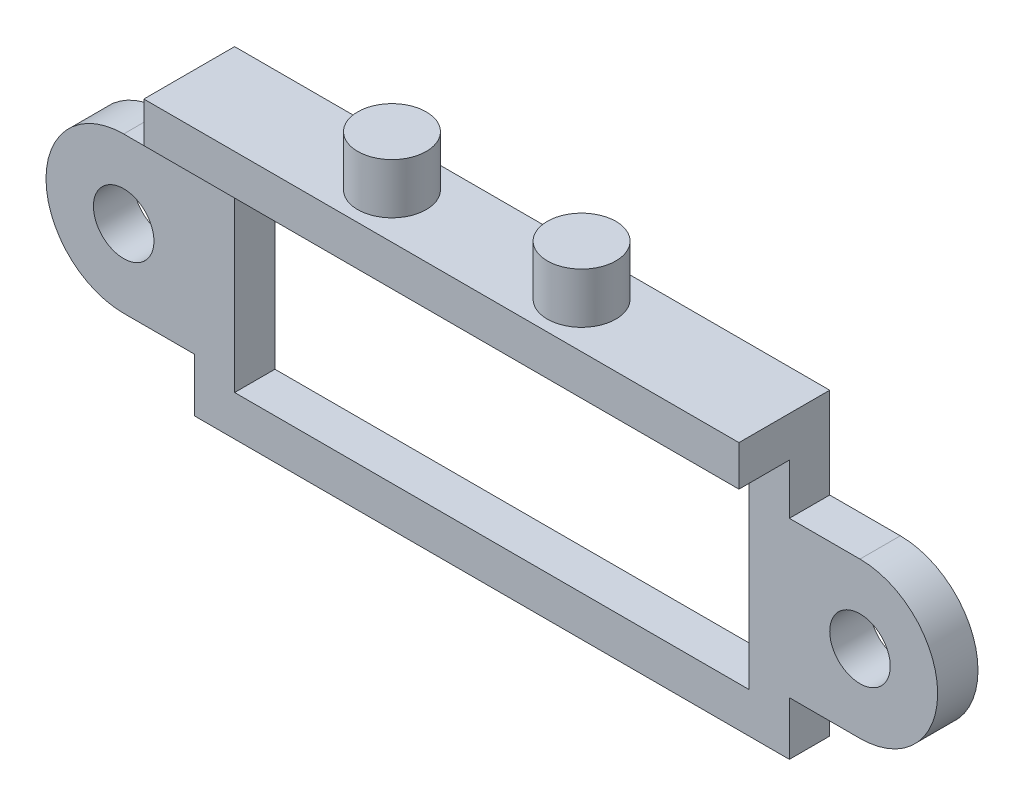
ISO-10303-21;
HEADER;
FILE_DESCRIPTION(('STEP AP214'),'2;1');
FILE_NAME('part.step','',(''),(''),'','','');
FILE_SCHEMA(('AUTOMOTIVE_DESIGN { 1 0 10303 214 1 1 1 1 }'));
ENDSEC;
DATA;
#1=APPLICATION_CONTEXT('core data for automotive mechanical design processes');
#2=APPLICATION_PROTOCOL_DEFINITION('international standard','automotive_design',2000,#1);
#3=PRODUCT_CONTEXT('',#1,'mechanical');
#4=PRODUCT('Part','Part','',(#3));
#5=PRODUCT_RELATED_PRODUCT_CATEGORY('part','',(#4));
#6=PRODUCT_DEFINITION_FORMATION('','',#4);
#7=PRODUCT_DEFINITION_CONTEXT('part definition',#1,'design');
#8=PRODUCT_DEFINITION('design','',#6,#7);
#9=PRODUCT_DEFINITION_SHAPE('','',#8);
#10=(LENGTH_UNIT() NAMED_UNIT(*) SI_UNIT(.MILLI.,.METRE.));
#11=(NAMED_UNIT(*) PLANE_ANGLE_UNIT() SI_UNIT($,.RADIAN.));
#12=(NAMED_UNIT(*) SI_UNIT($,.STERADIAN.) SOLID_ANGLE_UNIT());
#13=UNCERTAINTY_MEASURE_WITH_UNIT(LENGTH_MEASURE(1.E-05),#10,'distance_accuracy_value','');
#14=(GEOMETRIC_REPRESENTATION_CONTEXT(3) GLOBAL_UNCERTAINTY_ASSIGNED_CONTEXT((#13)) GLOBAL_UNIT_ASSIGNED_CONTEXT((#10,
#11,#12)) REPRESENTATION_CONTEXT('',''));
#15=CARTESIAN_POINT('',(0.,0.,0.));
#16=DIRECTION('',(0.,0.,1.));
#17=DIRECTION('',(1.,0.,0.));
#18=AXIS2_PLACEMENT_3D('',#15,#16,#17);
#19=CARTESIAN_POINT('',(-14.75,5.675,2.));
#20=DIRECTION('',(0.,-1.,0.));
#21=DIRECTION('',(1.,0.,0.));
#22=AXIS2_PLACEMENT_3D('',#19,#20,#21);
#23=PLANE('',#22);
#24=CARTESIAN_POINT('',(-4.7,5.675,2.25));
#25=DIRECTION('',(0.,-1.,0.));
#26=DIRECTION('',(1.,0.,0.));
#27=AXIS2_PLACEMENT_3D('',#24,#25,#26);
#28=CIRCLE('',#27,1.7);
#29=CARTESIAN_POINT('',(-3.,5.675,2.25));
#30=VERTEX_POINT('',#29);
#31=EDGE_CURVE('E43',#30,#30,#28,.F.);
#32=ORIENTED_EDGE('',*,*,#31,.F.);
#33=EDGE_LOOP('',(#32));
#34=FACE_BOUND('',#33,.T.);
#35=DIRECTION('',(-1.,0.,0.));
#36=VECTOR('',#35,1.);
#37=CARTESIAN_POINT('',(-14.75,5.675,0.));
#38=LINE('',#37,#36);
#39=CARTESIAN_POINT('',(14.75,5.675,0.));
#40=VERTEX_POINT('',#39);
#41=CARTESIAN_POINT('',(-14.75,5.675,0.));
#42=VERTEX_POINT('',#41);
#43=EDGE_CURVE('E306',#40,#42,#38,.T.);
#44=ORIENTED_EDGE('',*,*,#43,.T.);
#45=DIRECTION('',(0.,0.,-1.));
#46=VECTOR('',#45,1.);
#47=CARTESIAN_POINT('',(-14.75,5.675,2.));
#48=LINE('',#47,#46);
#49=CARTESIAN_POINT('',(-14.75,5.675,4.5));
#50=VERTEX_POINT('',#49);
#51=EDGE_CURVE('E284',#50,#42,#48,.T.);
#52=ORIENTED_EDGE('',*,*,#51,.F.);
#53=DIRECTION('',(-1.,0.,0.));
#54=VECTOR('',#53,1.);
#55=CARTESIAN_POINT('',(-14.75,5.675,4.5));
#56=LINE('',#55,#54);
#57=CARTESIAN_POINT('',(14.75,5.675,4.5));
#58=VERTEX_POINT('',#57);
#59=EDGE_CURVE('E179',#58,#50,#56,.T.);
#60=ORIENTED_EDGE('',*,*,#59,.F.);
#61=DIRECTION('',(0.,0.,-1.));
#62=VECTOR('',#61,1.);
#63=CARTESIAN_POINT('',(14.75,5.675,2.));
#64=LINE('',#63,#62);
#65=EDGE_CURVE('E281',#58,#40,#64,.T.);
#66=ORIENTED_EDGE('',*,*,#65,.T.);
#67=EDGE_LOOP('',(#44,#52,#60,#66));
#68=FACE_BOUND('',#67,.T.);
#69=CARTESIAN_POINT('',(4.7,5.675,2.25));
#70=DIRECTION('',(0.,-1.,0.));
#71=DIRECTION('',(1.,0.,0.));
#72=AXIS2_PLACEMENT_3D('',#69,#70,#71);
#73=CIRCLE('',#72,1.7);
#74=CARTESIAN_POINT('',(6.4,5.675,2.25));
#75=VERTEX_POINT('',#74);
#76=EDGE_CURVE('E11',#75,#75,#73,.F.);
#77=ORIENTED_EDGE('',*,*,#76,.F.);
#78=EDGE_LOOP('',(#77));
#79=FACE_BOUND('',#78,.T.);
#80=ADVANCED_FACE('F35',(#34,#68,#79),#23,.F.);
#81=CARTESIAN_POINT('',(18.25,-2.67499999999998,2.));
#82=DIRECTION('',(0.,0.,-1.));
#83=DIRECTION('',(-1.,0.,0.));
#84=AXIS2_PLACEMENT_3D('',#81,#82,#83);
#85=PLANE('',#84);
#86=CARTESIAN_POINT('',(-18.25,-2.675,2.));
#87=DIRECTION('',(0.,0.,1.));
#88=DIRECTION('',(1.,0.,0.));
#89=AXIS2_PLACEMENT_3D('',#86,#87,#88);
#90=CIRCLE('',#89,1.5);
#91=CARTESIAN_POINT('',(-16.75,-2.675,2.));
#92=VERTEX_POINT('',#91);
#93=EDGE_CURVE('E242',#92,#92,#90,.T.);
#94=ORIENTED_EDGE('',*,*,#93,.F.);
#95=EDGE_LOOP('',(#94));
#96=FACE_BOUND('',#95,.T.);
#97=CARTESIAN_POINT('',(18.25,-2.67499999999998,2.));
#98=DIRECTION('',(0.,0.,1.));
#99=DIRECTION('',(-1.,0.,0.));
#100=AXIS2_PLACEMENT_3D('',#97,#98,#99);
#101=CIRCLE('',#100,1.5);
#102=CARTESIAN_POINT('',(16.75,-2.67499999999998,2.));
#103=VERTEX_POINT('',#102);
#104=EDGE_CURVE('E236',#103,#103,#101,.T.);
#105=ORIENTED_EDGE('',*,*,#104,.F.);
#106=EDGE_LOOP('',(#105));
#107=FACE_BOUND('',#106,.T.);
#108=DIRECTION('',(1.,0.,0.));
#109=VECTOR('',#108,1.);
#110=CARTESIAN_POINT('',(-14.75,3.675,2.));
#111=LINE('',#110,#109);
#112=CARTESIAN_POINT('',(-14.75,3.675,2.));
#113=VERTEX_POINT('',#112);
#114=CARTESIAN_POINT('',(-12.75,3.675,2.));
#115=VERTEX_POINT('',#114);
#116=EDGE_CURVE('E50',#113,#115,#111,.T.);
#117=ORIENTED_EDGE('',*,*,#116,.F.);
#118=DIRECTION('',(0.,-1.,0.));
#119=VECTOR('',#118,1.);
#120=CARTESIAN_POINT('',(-14.75,5.675,2.));
#121=LINE('',#120,#119);
#122=CARTESIAN_POINT('',(-14.75,1.175,2.));
#123=VERTEX_POINT('',#122);
#124=EDGE_CURVE('E185',#113,#123,#121,.T.);
#125=ORIENTED_EDGE('',*,*,#124,.T.);
#126=DIRECTION('',(-1.,0.,0.));
#127=VECTOR('',#126,1.);
#128=CARTESIAN_POINT('',(-14.75,1.175,2.));
#129=LINE('',#128,#127);
#130=CARTESIAN_POINT('',(-18.25,1.175,2.));
#131=VERTEX_POINT('',#130);
#132=EDGE_CURVE('E324',#123,#131,#129,.T.);
#133=ORIENTED_EDGE('',*,*,#132,.T.);
#134=CARTESIAN_POINT('',(-18.25,-2.675,2.));
#135=DIRECTION('',(0.,0.,1.));
#136=DIRECTION('',(1.,0.,0.));
#137=AXIS2_PLACEMENT_3D('',#134,#135,#136);
#138=CIRCLE('',#137,3.85);
#139=CARTESIAN_POINT('',(-18.25,-6.525,2.));
#140=VERTEX_POINT('',#139);
#141=EDGE_CURVE('E323',#131,#140,#138,.T.);
#142=ORIENTED_EDGE('',*,*,#141,.T.);
#143=DIRECTION('',(1.,0.,0.));
#144=VECTOR('',#143,1.);
#145=CARTESIAN_POINT('',(-14.75,-6.525,2.));
#146=LINE('',#145,#144);
#147=CARTESIAN_POINT('',(-14.75,-6.525,2.));
#148=VERTEX_POINT('',#147);
#149=EDGE_CURVE('E298',#140,#148,#146,.T.);
#150=ORIENTED_EDGE('',*,*,#149,.T.);
#151=DIRECTION('',(0.,-1.,0.));
#152=VECTOR('',#151,1.);
#153=CARTESIAN_POINT('',(-14.75,-6.525,2.));
#154=LINE('',#153,#152);
#155=CARTESIAN_POINT('',(-14.75,-9.175,2.));
#156=VERTEX_POINT('',#155);
#157=EDGE_CURVE('E248',#148,#156,#154,.T.);
#158=ORIENTED_EDGE('',*,*,#157,.T.);
#159=DIRECTION('',(1.,0.,0.));
#160=VECTOR('',#159,1.);
#161=CARTESIAN_POINT('',(-14.75,-9.175,2.));
#162=LINE('',#161,#160);
#163=CARTESIAN_POINT('',(14.75,-9.17499999999998,2.));
#164=VERTEX_POINT('',#163);
#165=EDGE_CURVE('E251',#156,#164,#162,.T.);
#166=ORIENTED_EDGE('',*,*,#165,.T.);
#167=DIRECTION('',(0.,1.,0.));
#168=VECTOR('',#167,1.);
#169=CARTESIAN_POINT('',(14.75,-6.52499999999998,2.));
#170=LINE('',#169,#168);
#171=CARTESIAN_POINT('',(14.75,-6.52499999999998,2.));
#172=VERTEX_POINT('',#171);
#173=EDGE_CURVE('E254',#164,#172,#170,.T.);
#174=ORIENTED_EDGE('',*,*,#173,.T.);
#175=DIRECTION('',(1.,0.,0.));
#176=VECTOR('',#175,1.);
#177=CARTESIAN_POINT('',(14.75,-6.52499999999998,2.));
#178=LINE('',#177,#176);
#179=CARTESIAN_POINT('',(18.25,-6.52499999999997,2.));
#180=VERTEX_POINT('',#179);
#181=EDGE_CURVE('E256',#172,#180,#178,.T.);
#182=ORIENTED_EDGE('',*,*,#181,.T.);
#183=CARTESIAN_POINT('',(18.25,-2.67499999999998,2.));
#184=DIRECTION('',(0.,0.,1.));
#185=DIRECTION('',(-1.,0.,0.));
#186=AXIS2_PLACEMENT_3D('',#183,#184,#185);
#187=CIRCLE('',#186,3.85);
#188=CARTESIAN_POINT('',(18.25,1.17500000000002,2.));
#189=VERTEX_POINT('',#188);
#190=EDGE_CURVE('E258',#180,#189,#187,.T.);
#191=ORIENTED_EDGE('',*,*,#190,.T.);
#192=DIRECTION('',(-1.,0.,0.));
#193=VECTOR('',#192,1.);
#194=CARTESIAN_POINT('',(14.75,1.17500000000002,2.));
#195=LINE('',#194,#193);
#196=CARTESIAN_POINT('',(14.75,1.17500000000002,2.));
#197=VERTEX_POINT('',#196);
#198=EDGE_CURVE('E260',#189,#197,#195,.T.);
#199=ORIENTED_EDGE('',*,*,#198,.T.);
#200=DIRECTION('',(0.,1.,0.));
#201=VECTOR('',#200,1.);
#202=CARTESIAN_POINT('',(14.75,5.675,2.));
#203=LINE('',#202,#201);
#204=CARTESIAN_POINT('',(14.75,3.675,2.));
#205=VERTEX_POINT('',#204);
#206=EDGE_CURVE('E262',#197,#205,#203,.T.);
#207=ORIENTED_EDGE('',*,*,#206,.T.);
#208=CARTESIAN_POINT('',(12.75,3.675,2.));
#209=VERTEX_POINT('',#208);
#210=EDGE_CURVE('E57',#209,#205,#111,.T.);
#211=ORIENTED_EDGE('',*,*,#210,.F.);
#212=DIRECTION('',(0.,1.,0.));
#213=VECTOR('',#212,1.);
#214=CARTESIAN_POINT('',(12.75,-7.175,2.));
#215=LINE('',#214,#213);
#216=CARTESIAN_POINT('',(12.75,-7.175,2.));
#217=VERTEX_POINT('',#216);
#218=EDGE_CURVE('E218',#217,#209,#215,.T.);
#219=ORIENTED_EDGE('',*,*,#218,.F.);
#220=DIRECTION('',(1.,0.,0.));
#221=VECTOR('',#220,1.);
#222=CARTESIAN_POINT('',(-12.75,-7.175,2.));
#223=LINE('',#222,#221);
#224=CARTESIAN_POINT('',(-12.75,-7.175,2.));
#225=VERTEX_POINT('',#224);
#226=EDGE_CURVE('E217',#225,#217,#223,.T.);
#227=ORIENTED_EDGE('',*,*,#226,.F.);
#228=DIRECTION('',(0.,-1.,0.));
#229=VECTOR('',#228,1.);
#230=CARTESIAN_POINT('',(-12.75,-7.175,2.));
#231=LINE('',#230,#229);
#232=EDGE_CURVE('E219',#115,#225,#231,.T.);
#233=ORIENTED_EDGE('',*,*,#232,.F.);
#234=EDGE_LOOP('',(#117,#125,#133,#142,#150,#158,#166,#174,#182,#191,#199,#207,#211,#219,#227,#233));
#235=FACE_BOUND('',#234,.T.);
#236=ADVANCED_FACE('F327',(#96,#107,#235),#85,.F.);
#237=CARTESIAN_POINT('',(18.25,-2.67499999999998,0.));
#238=DIRECTION('',(0.,0.,-1.));
#239=DIRECTION('',(-1.,0.,0.));
#240=AXIS2_PLACEMENT_3D('',#237,#238,#239);
#241=PLANE('',#240);
#242=CARTESIAN_POINT('',(18.25,-2.67499999999998,0.));
#243=DIRECTION('',(0.,0.,1.));
#244=DIRECTION('',(-1.,0.,0.));
#245=AXIS2_PLACEMENT_3D('',#242,#243,#244);
#246=CIRCLE('',#245,1.5);
#247=CARTESIAN_POINT('',(16.75,-2.67499999999998,0.));
#248=VERTEX_POINT('',#247);
#249=EDGE_CURVE('E235',#248,#248,#246,.T.);
#250=ORIENTED_EDGE('',*,*,#249,.T.);
#251=EDGE_LOOP('',(#250));
#252=FACE_BOUND('',#251,.T.);
#253=DIRECTION('',(0.,-1.,0.));
#254=VECTOR('',#253,1.);
#255=CARTESIAN_POINT('',(-14.75,-6.525,0.));
#256=LINE('',#255,#254);
#257=CARTESIAN_POINT('',(-14.75,-6.525,0.));
#258=VERTEX_POINT('',#257);
#259=CARTESIAN_POINT('',(-14.75,-9.175,0.));
#260=VERTEX_POINT('',#259);
#261=EDGE_CURVE('E245',#258,#260,#256,.T.);
#262=ORIENTED_EDGE('',*,*,#261,.F.);
#263=DIRECTION('',(1.,0.,0.));
#264=VECTOR('',#263,1.);
#265=CARTESIAN_POINT('',(-14.75,-6.525,0.));
#266=LINE('',#265,#264);
#267=CARTESIAN_POINT('',(-18.25,-6.525,0.));
#268=VERTEX_POINT('',#267);
#269=EDGE_CURVE('E252',#268,#258,#266,.T.);
#270=ORIENTED_EDGE('',*,*,#269,.F.);
#271=CARTESIAN_POINT('',(-18.25,-2.675,0.));
#272=DIRECTION('',(0.,0.,1.));
#273=DIRECTION('',(1.,0.,0.));
#274=AXIS2_PLACEMENT_3D('',#271,#272,#273);
#275=CIRCLE('',#274,3.85);
#276=CARTESIAN_POINT('',(-18.25,1.175,0.));
#277=VERTEX_POINT('',#276);
#278=EDGE_CURVE('E300',#277,#268,#275,.T.);
#279=ORIENTED_EDGE('',*,*,#278,.F.);
#280=DIRECTION('',(-1.,0.,0.));
#281=VECTOR('',#280,1.);
#282=CARTESIAN_POINT('',(-14.75,1.175,0.));
#283=LINE('',#282,#281);
#284=CARTESIAN_POINT('',(-14.75,1.175,0.));
#285=VERTEX_POINT('',#284);
#286=EDGE_CURVE('E302',#285,#277,#283,.T.);
#287=ORIENTED_EDGE('',*,*,#286,.F.);
#288=DIRECTION('',(0.,-1.,0.));
#289=VECTOR('',#288,1.);
#290=CARTESIAN_POINT('',(-14.75,5.675,0.));
#291=LINE('',#290,#289);
#292=EDGE_CURVE('E304',#42,#285,#291,.T.);
#293=ORIENTED_EDGE('',*,*,#292,.F.);
#294=ORIENTED_EDGE('',*,*,#43,.F.);
#295=DIRECTION('',(0.,1.,0.));
#296=VECTOR('',#295,1.);
#297=CARTESIAN_POINT('',(14.75,5.675,0.));
#298=LINE('',#297,#296);
#299=CARTESIAN_POINT('',(14.75,1.17500000000002,0.));
#300=VERTEX_POINT('',#299);
#301=EDGE_CURVE('E308',#300,#40,#298,.T.);
#302=ORIENTED_EDGE('',*,*,#301,.F.);
#303=DIRECTION('',(-1.,0.,0.));
#304=VECTOR('',#303,1.);
#305=CARTESIAN_POINT('',(14.75,1.17500000000002,0.));
#306=LINE('',#305,#304);
#307=CARTESIAN_POINT('',(18.25,1.17500000000002,0.));
#308=VERTEX_POINT('',#307);
#309=EDGE_CURVE('E310',#308,#300,#306,.T.);
#310=ORIENTED_EDGE('',*,*,#309,.F.);
#311=CARTESIAN_POINT('',(18.25,-2.67499999999998,0.));
#312=DIRECTION('',(0.,0.,1.));
#313=DIRECTION('',(-1.,0.,0.));
#314=AXIS2_PLACEMENT_3D('',#311,#312,#313);
#315=CIRCLE('',#314,3.85);
#316=CARTESIAN_POINT('',(18.25,-6.52499999999997,0.));
#317=VERTEX_POINT('',#316);
#318=EDGE_CURVE('E312',#317,#308,#315,.T.);
#319=ORIENTED_EDGE('',*,*,#318,.F.);
#320=DIRECTION('',(1.,0.,0.));
#321=VECTOR('',#320,1.);
#322=CARTESIAN_POINT('',(14.75,-6.52499999999998,0.));
#323=LINE('',#322,#321);
#324=CARTESIAN_POINT('',(14.75,-6.52499999999998,0.));
#325=VERTEX_POINT('',#324);
#326=EDGE_CURVE('E314',#325,#317,#323,.T.);
#327=ORIENTED_EDGE('',*,*,#326,.F.);
#328=DIRECTION('',(0.,1.,0.));
#329=VECTOR('',#328,1.);
#330=CARTESIAN_POINT('',(14.75,-6.52499999999998,0.));
#331=LINE('',#330,#329);
#332=CARTESIAN_POINT('',(14.75,-9.17499999999998,0.));
#333=VERTEX_POINT('',#332);
#334=EDGE_CURVE('E316',#333,#325,#331,.T.);
#335=ORIENTED_EDGE('',*,*,#334,.F.);
#336=DIRECTION('',(1.,0.,0.));
#337=VECTOR('',#336,1.);
#338=CARTESIAN_POINT('',(-14.75,-9.175,0.));
#339=LINE('',#338,#337);
#340=EDGE_CURVE('E318',#260,#333,#339,.T.);
#341=ORIENTED_EDGE('',*,*,#340,.F.);
#342=EDGE_LOOP('',(#262,#270,#279,#287,#293,#294,#302,#310,#319,#327,#335,#341));
#343=FACE_BOUND('',#342,.T.);
#344=CARTESIAN_POINT('',(-18.25,-2.675,0.));
#345=DIRECTION('',(0.,0.,1.));
#346=DIRECTION('',(1.,0.,0.));
#347=AXIS2_PLACEMENT_3D('',#344,#345,#346);
#348=CIRCLE('',#347,1.5);
#349=CARTESIAN_POINT('',(-16.75,-2.675,0.));
#350=VERTEX_POINT('',#349);
#351=EDGE_CURVE('E239',#350,#350,#348,.T.);
#352=ORIENTED_EDGE('',*,*,#351,.T.);
#353=EDGE_LOOP('',(#352));
#354=FACE_BOUND('',#353,.T.);
#355=DIRECTION('',(-1.,0.,0.));
#356=VECTOR('',#355,1.);
#357=CARTESIAN_POINT('',(-12.75,3.675,0.));
#358=LINE('',#357,#356);
#359=CARTESIAN_POINT('',(12.75,3.675,0.));
#360=VERTEX_POINT('',#359);
#361=CARTESIAN_POINT('',(-12.75,3.675,0.));
#362=VERTEX_POINT('',#361);
#363=EDGE_CURVE('E226',#360,#362,#358,.T.);
#364=ORIENTED_EDGE('',*,*,#363,.T.);
#365=DIRECTION('',(0.,-1.,0.));
#366=VECTOR('',#365,1.);
#367=CARTESIAN_POINT('',(-12.75,-7.175,0.));
#368=LINE('',#367,#366);
#369=CARTESIAN_POINT('',(-12.75,-7.175,0.));
#370=VERTEX_POINT('',#369);
#371=EDGE_CURVE('E186',#362,#370,#368,.T.);
#372=ORIENTED_EDGE('',*,*,#371,.T.);
#373=DIRECTION('',(1.,0.,0.));
#374=VECTOR('',#373,1.);
#375=CARTESIAN_POINT('',(-12.75,-7.175,0.));
#376=LINE('',#375,#374);
#377=CARTESIAN_POINT('',(12.75,-7.175,0.));
#378=VERTEX_POINT('',#377);
#379=EDGE_CURVE('E189',#370,#378,#376,.T.);
#380=ORIENTED_EDGE('',*,*,#379,.T.);
#381=DIRECTION('',(0.,1.,0.));
#382=VECTOR('',#381,1.);
#383=CARTESIAN_POINT('',(12.75,-7.175,0.));
#384=LINE('',#383,#382);
#385=EDGE_CURVE('E223',#378,#360,#384,.T.);
#386=ORIENTED_EDGE('',*,*,#385,.T.);
#387=EDGE_LOOP('',(#364,#372,#380,#386));
#388=FACE_BOUND('',#387,.T.);
#389=ADVANCED_FACE('F395',(#252,#343,#354,#388),#241,.T.);
#390=CARTESIAN_POINT('',(-14.75,-6.525,2.));
#391=DIRECTION('',(1.,0.,0.));
#392=DIRECTION('',(0.,0.,-1.));
#393=AXIS2_PLACEMENT_3D('',#390,#391,#392);
#394=PLANE('',#393);
#395=ORIENTED_EDGE('',*,*,#261,.T.);
#396=DIRECTION('',(0.,0.,-1.));
#397=VECTOR('',#396,1.);
#398=CARTESIAN_POINT('',(-14.75,-9.175,2.));
#399=LINE('',#398,#397);
#400=EDGE_CURVE('E200',#156,#260,#399,.T.);
#401=ORIENTED_EDGE('',*,*,#400,.F.);
#402=ORIENTED_EDGE('',*,*,#157,.F.);
#403=DIRECTION('',(0.,0.,-1.));
#404=VECTOR('',#403,1.);
#405=CARTESIAN_POINT('',(-14.75,-6.525,2.));
#406=LINE('',#405,#404);
#407=EDGE_CURVE('E295',#148,#258,#406,.T.);
#408=ORIENTED_EDGE('',*,*,#407,.T.);
#409=EDGE_LOOP('',(#395,#401,#402,#408));
#410=FACE_BOUND('',#409,.T.);
#411=ADVANCED_FACE('F37',(#410),#394,.F.);
#412=CARTESIAN_POINT('',(-14.75,-9.175,2.));
#413=DIRECTION('',(0.,1.,0.));
#414=DIRECTION('',(-1.,0.,0.));
#415=AXIS2_PLACEMENT_3D('',#412,#413,#414);
#416=PLANE('',#415);
#417=ORIENTED_EDGE('',*,*,#340,.T.);
#418=DIRECTION('',(0.,0.,-1.));
#419=VECTOR('',#418,1.);
#420=CARTESIAN_POINT('',(14.75,-9.17499999999998,2.));
#421=LINE('',#420,#419);
#422=EDGE_CURVE('E203',#164,#333,#421,.T.);
#423=ORIENTED_EDGE('',*,*,#422,.F.);
#424=ORIENTED_EDGE('',*,*,#165,.F.);
#425=ORIENTED_EDGE('',*,*,#400,.T.);
#426=EDGE_LOOP('',(#417,#423,#424,#425));
#427=FACE_BOUND('',#426,.T.);
#428=ADVANCED_FACE('F347',(#427),#416,.F.);
#429=CARTESIAN_POINT('',(14.75,-6.52499999999998,2.));
#430=DIRECTION('',(-1.,0.,0.));
#431=DIRECTION('',(0.,-1.,0.));
#432=AXIS2_PLACEMENT_3D('',#429,#430,#431);
#433=PLANE('',#432);
#434=ORIENTED_EDGE('',*,*,#334,.T.);
#435=DIRECTION('',(0.,0.,-1.));
#436=VECTOR('',#435,1.);
#437=CARTESIAN_POINT('',(14.75,-6.52499999999998,2.));
#438=LINE('',#437,#436);
#439=EDGE_CURVE('E269',#172,#325,#438,.T.);
#440=ORIENTED_EDGE('',*,*,#439,.F.);
#441=ORIENTED_EDGE('',*,*,#173,.F.);
#442=ORIENTED_EDGE('',*,*,#422,.T.);
#443=EDGE_LOOP('',(#434,#440,#441,#442));
#444=FACE_BOUND('',#443,.T.);
#445=ADVANCED_FACE('F354',(#444),#433,.F.);
#446=CARTESIAN_POINT('',(14.75,-6.52499999999998,2.));
#447=DIRECTION('',(0.,1.,0.));
#448=DIRECTION('',(-1.,0.,0.));
#449=AXIS2_PLACEMENT_3D('',#446,#447,#448);
#450=PLANE('',#449);
#451=ORIENTED_EDGE('',*,*,#326,.T.);
#452=DIRECTION('',(0.,0.,-1.));
#453=VECTOR('',#452,1.);
#454=CARTESIAN_POINT('',(18.25,-6.52499999999997,2.));
#455=LINE('',#454,#453);
#456=EDGE_CURVE('E272',#180,#317,#455,.T.);
#457=ORIENTED_EDGE('',*,*,#456,.F.);
#458=ORIENTED_EDGE('',*,*,#181,.F.);
#459=ORIENTED_EDGE('',*,*,#439,.T.);
#460=EDGE_LOOP('',(#451,#457,#458,#459));
#461=FACE_BOUND('',#460,.T.);
#462=ADVANCED_FACE('F358',(#461),#450,.F.);
#463=CARTESIAN_POINT('',(18.25,-2.67499999999998,2.));
#464=DIRECTION('',(0.,0.,-1.));
#465=DIRECTION('',(-1.,0.,0.));
#466=AXIS2_PLACEMENT_3D('',#463,#464,#465);
#467=CYLINDRICAL_SURFACE('',#466,3.85);
#468=ORIENTED_EDGE('',*,*,#318,.T.);
#469=DIRECTION('',(0.,0.,-1.));
#470=VECTOR('',#469,1.);
#471=CARTESIAN_POINT('',(18.25,1.17500000000002,2.));
#472=LINE('',#471,#470);
#473=EDGE_CURVE('E275',#189,#308,#472,.T.);
#474=ORIENTED_EDGE('',*,*,#473,.F.);
#475=ORIENTED_EDGE('',*,*,#190,.F.);
#476=ORIENTED_EDGE('',*,*,#456,.T.);
#477=EDGE_LOOP('',(#468,#474,#475,#476));
#478=FACE_BOUND('',#477,.T.);
#479=ADVANCED_FACE('F363',(#478),#467,.T.);
#480=CARTESIAN_POINT('',(14.75,1.17500000000002,2.));
#481=DIRECTION('',(0.,-1.,0.));
#482=DIRECTION('',(1.,0.,0.));
#483=AXIS2_PLACEMENT_3D('',#480,#481,#482);
#484=PLANE('',#483);
#485=ORIENTED_EDGE('',*,*,#309,.T.);
#486=DIRECTION('',(0.,0.,-1.));
#487=VECTOR('',#486,1.);
#488=CARTESIAN_POINT('',(14.75,1.17500000000002,2.));
#489=LINE('',#488,#487);
#490=EDGE_CURVE('E278',#197,#300,#489,.T.);
#491=ORIENTED_EDGE('',*,*,#490,.F.);
#492=ORIENTED_EDGE('',*,*,#198,.F.);
#493=ORIENTED_EDGE('',*,*,#473,.T.);
#494=EDGE_LOOP('',(#485,#491,#492,#493));
#495=FACE_BOUND('',#494,.T.);
#496=ADVANCED_FACE('F368',(#495),#484,.F.);
#497=CARTESIAN_POINT('',(14.75,5.675,2.));
#498=DIRECTION('',(-1.,0.,0.));
#499=DIRECTION('',(0.,-1.,0.));
#500=AXIS2_PLACEMENT_3D('',#497,#498,#499);
#501=PLANE('',#500);
#502=ORIENTED_EDGE('',*,*,#301,.T.);
#503=ORIENTED_EDGE('',*,*,#65,.F.);
#504=DIRECTION('',(0.,1.,0.));
#505=VECTOR('',#504,1.);
#506=CARTESIAN_POINT('',(14.75,5.675,4.5));
#507=LINE('',#506,#505);
#508=CARTESIAN_POINT('',(14.75,3.675,4.5));
#509=VERTEX_POINT('',#508);
#510=EDGE_CURVE('E172',#509,#58,#507,.T.);
#511=ORIENTED_EDGE('',*,*,#510,.F.);
#512=DIRECTION('',(0.,0.,-1.));
#513=VECTOR('',#512,1.);
#514=CARTESIAN_POINT('',(14.75,3.675,4.5));
#515=LINE('',#514,#513);
#516=EDGE_CURVE('E168',#509,#205,#515,.T.);
#517=ORIENTED_EDGE('',*,*,#516,.T.);
#518=ORIENTED_EDGE('',*,*,#206,.F.);
#519=ORIENTED_EDGE('',*,*,#490,.T.);
#520=EDGE_LOOP('',(#502,#503,#511,#517,#518,#519));
#521=FACE_BOUND('',#520,.T.);
#522=ADVANCED_FACE('F372',(#521),#501,.F.);
#523=CARTESIAN_POINT('',(-14.75,5.675,2.));
#524=DIRECTION('',(1.,0.,0.));
#525=DIRECTION('',(0.,0.,-1.));
#526=AXIS2_PLACEMENT_3D('',#523,#524,#525);
#527=PLANE('',#526);
#528=ORIENTED_EDGE('',*,*,#292,.T.);
#529=DIRECTION('',(0.,0.,-1.));
#530=VECTOR('',#529,1.);
#531=CARTESIAN_POINT('',(-14.75,1.175,2.));
#532=LINE('',#531,#530);
#533=EDGE_CURVE('E286',#123,#285,#532,.T.);
#534=ORIENTED_EDGE('',*,*,#533,.F.);
#535=ORIENTED_EDGE('',*,*,#124,.F.);
#536=DIRECTION('',(0.,0.,-1.));
#537=VECTOR('',#536,1.);
#538=CARTESIAN_POINT('',(-14.75,3.675,4.5));
#539=LINE('',#538,#537);
#540=CARTESIAN_POINT('',(-14.75,3.675,4.5));
#541=VERTEX_POINT('',#540);
#542=EDGE_CURVE('E166',#541,#113,#539,.T.);
#543=ORIENTED_EDGE('',*,*,#542,.F.);
#544=DIRECTION('',(0.,-1.,0.));
#545=VECTOR('',#544,1.);
#546=CARTESIAN_POINT('',(-14.75,5.675,4.5));
#547=LINE('',#546,#545);
#548=EDGE_CURVE('E173',#50,#541,#547,.T.);
#549=ORIENTED_EDGE('',*,*,#548,.F.);
#550=ORIENTED_EDGE('',*,*,#51,.T.);
#551=EDGE_LOOP('',(#528,#534,#535,#543,#549,#550));
#552=FACE_BOUND('',#551,.T.);
#553=ADVANCED_FACE('F183',(#552),#527,.F.);
#554=CARTESIAN_POINT('',(-14.75,1.175,2.));
#555=DIRECTION('',(0.,-1.,0.));
#556=DIRECTION('',(1.,0.,0.));
#557=AXIS2_PLACEMENT_3D('',#554,#555,#556);
#558=PLANE('',#557);
#559=ORIENTED_EDGE('',*,*,#286,.T.);
#560=DIRECTION('',(0.,0.,-1.));
#561=VECTOR('',#560,1.);
#562=CARTESIAN_POINT('',(-18.25,1.175,2.));
#563=LINE('',#562,#561);
#564=EDGE_CURVE('E289',#131,#277,#563,.T.);
#565=ORIENTED_EDGE('',*,*,#564,.F.);
#566=ORIENTED_EDGE('',*,*,#132,.F.);
#567=ORIENTED_EDGE('',*,*,#533,.T.);
#568=EDGE_LOOP('',(#559,#565,#566,#567));
#569=FACE_BOUND('',#568,.T.);
#570=ADVANCED_FACE('F331',(#569),#558,.F.);
#571=CARTESIAN_POINT('',(-18.25,-2.675,2.));
#572=DIRECTION('',(0.,0.,-1.));
#573=DIRECTION('',(-1.,0.,0.));
#574=AXIS2_PLACEMENT_3D('',#571,#572,#573);
#575=CYLINDRICAL_SURFACE('',#574,3.85);
#576=ORIENTED_EDGE('',*,*,#278,.T.);
#577=DIRECTION('',(0.,0.,-1.));
#578=VECTOR('',#577,1.);
#579=CARTESIAN_POINT('',(-18.25,-6.525,2.));
#580=LINE('',#579,#578);
#581=EDGE_CURVE('E292',#140,#268,#580,.T.);
#582=ORIENTED_EDGE('',*,*,#581,.F.);
#583=ORIENTED_EDGE('',*,*,#141,.F.);
#584=ORIENTED_EDGE('',*,*,#564,.T.);
#585=EDGE_LOOP('',(#576,#582,#583,#584));
#586=FACE_BOUND('',#585,.T.);
#587=ADVANCED_FACE('F336',(#586),#575,.T.);
#588=CARTESIAN_POINT('',(-14.75,-6.525,2.));
#589=DIRECTION('',(0.,1.,0.));
#590=DIRECTION('',(0.,0.,1.));
#591=AXIS2_PLACEMENT_3D('',#588,#589,#590);
#592=PLANE('',#591);
#593=ORIENTED_EDGE('',*,*,#269,.T.);
#594=ORIENTED_EDGE('',*,*,#407,.F.);
#595=ORIENTED_EDGE('',*,*,#149,.F.);
#596=ORIENTED_EDGE('',*,*,#581,.T.);
#597=EDGE_LOOP('',(#593,#594,#595,#596));
#598=FACE_BOUND('',#597,.T.);
#599=ADVANCED_FACE('F342',(#598),#592,.F.);
#600=CARTESIAN_POINT('',(-18.25,-2.675,2.));
#601=DIRECTION('',(0.,0.,-1.));
#602=DIRECTION('',(-1.,0.,0.));
#603=AXIS2_PLACEMENT_3D('',#600,#601,#602);
#604=CYLINDRICAL_SURFACE('',#603,1.5);
#605=ORIENTED_EDGE('',*,*,#93,.T.);
#606=EDGE_LOOP('',(#605));
#607=FACE_BOUND('',#606,.T.);
#608=ORIENTED_EDGE('',*,*,#351,.F.);
#609=EDGE_LOOP('',(#608));
#610=FACE_BOUND('',#609,.T.);
#611=ADVANCED_FACE('F427',(#607,#610),#604,.F.);
#612=CARTESIAN_POINT('',(18.25,-2.67499999999998,2.));
#613=DIRECTION('',(0.,0.,-1.));
#614=DIRECTION('',(-1.,0.,0.));
#615=AXIS2_PLACEMENT_3D('',#612,#613,#614);
#616=CYLINDRICAL_SURFACE('',#615,1.5);
#617=ORIENTED_EDGE('',*,*,#104,.T.);
#618=EDGE_LOOP('',(#617));
#619=FACE_BOUND('',#618,.T.);
#620=ORIENTED_EDGE('',*,*,#249,.F.);
#621=EDGE_LOOP('',(#620));
#622=FACE_BOUND('',#621,.T.);
#623=ADVANCED_FACE('F511',(#619,#622),#616,.F.);
#624=CARTESIAN_POINT('',(-12.75,-7.175,2.));
#625=DIRECTION('',(1.,0.,0.));
#626=DIRECTION('',(0.,1.,0.));
#627=AXIS2_PLACEMENT_3D('',#624,#625,#626);
#628=PLANE('',#627);
#629=ORIENTED_EDGE('',*,*,#371,.F.);
#630=DIRECTION('',(0.,0.,-1.));
#631=VECTOR('',#630,1.);
#632=CARTESIAN_POINT('',(-12.75,3.675,2.));
#633=LINE('',#632,#631);
#634=EDGE_CURVE('E624',#115,#362,#633,.T.);
#635=ORIENTED_EDGE('',*,*,#634,.F.);
#636=ORIENTED_EDGE('',*,*,#232,.T.);
#637=DIRECTION('',(0.,0.,-1.));
#638=VECTOR('',#637,1.);
#639=CARTESIAN_POINT('',(-12.75,-7.175,2.));
#640=LINE('',#639,#638);
#641=EDGE_CURVE('E231',#225,#370,#640,.T.);
#642=ORIENTED_EDGE('',*,*,#641,.T.);
#643=EDGE_LOOP('',(#629,#635,#636,#642));
#644=FACE_BOUND('',#643,.T.);
#645=ADVANCED_FACE('F519',(#644),#628,.T.);
#646=CARTESIAN_POINT('',(-12.75,-7.175,2.));
#647=DIRECTION('',(0.,1.,0.));
#648=DIRECTION('',(0.,0.,1.));
#649=AXIS2_PLACEMENT_3D('',#646,#647,#648);
#650=PLANE('',#649);
#651=ORIENTED_EDGE('',*,*,#379,.F.);
#652=ORIENTED_EDGE('',*,*,#641,.F.);
#653=ORIENTED_EDGE('',*,*,#226,.T.);
#654=DIRECTION('',(0.,0.,-1.));
#655=VECTOR('',#654,1.);
#656=CARTESIAN_POINT('',(12.75,-7.175,2.));
#657=LINE('',#656,#655);
#658=EDGE_CURVE('E229',#217,#378,#657,.T.);
#659=ORIENTED_EDGE('',*,*,#658,.T.);
#660=EDGE_LOOP('',(#651,#652,#653,#659));
#661=FACE_BOUND('',#660,.T.);
#662=ADVANCED_FACE('F528',(#661),#650,.T.);
#663=CARTESIAN_POINT('',(12.75,-7.175,2.));
#664=DIRECTION('',(-1.,0.,0.));
#665=DIRECTION('',(0.,-1.,0.));
#666=AXIS2_PLACEMENT_3D('',#663,#664,#665);
#667=PLANE('',#666);
#668=ORIENTED_EDGE('',*,*,#385,.F.);
#669=ORIENTED_EDGE('',*,*,#658,.F.);
#670=ORIENTED_EDGE('',*,*,#218,.T.);
#671=DIRECTION('',(0.,0.,-1.));
#672=VECTOR('',#671,1.);
#673=CARTESIAN_POINT('',(12.75,3.675,2.));
#674=LINE('',#673,#672);
#675=EDGE_CURVE('E232',#209,#360,#674,.T.);
#676=ORIENTED_EDGE('',*,*,#675,.T.);
#677=EDGE_LOOP('',(#668,#669,#670,#676));
#678=FACE_BOUND('',#677,.T.);
#679=ADVANCED_FACE('F537',(#678),#667,.T.);
#680=CARTESIAN_POINT('',(-12.75,3.675,2.));
#681=DIRECTION('',(0.,-1.,0.));
#682=DIRECTION('',(0.,0.,-1.));
#683=AXIS2_PLACEMENT_3D('',#680,#681,#682);
#684=PLANE('',#683);
#685=ORIENTED_EDGE('',*,*,#363,.F.);
#686=ORIENTED_EDGE('',*,*,#675,.F.);
#687=ORIENTED_EDGE('',*,*,#210,.T.);
#688=ORIENTED_EDGE('',*,*,#516,.F.);
#689=DIRECTION('',(1.,0.,0.));
#690=VECTOR('',#689,1.);
#691=CARTESIAN_POINT('',(-14.75,3.675,4.5));
#692=LINE('',#691,#690);
#693=EDGE_CURVE('E161',#541,#509,#692,.T.);
#694=ORIENTED_EDGE('',*,*,#693,.F.);
#695=ORIENTED_EDGE('',*,*,#542,.T.);
#696=ORIENTED_EDGE('',*,*,#116,.T.);
#697=ORIENTED_EDGE('',*,*,#634,.T.);
#698=EDGE_LOOP('',(#685,#686,#687,#688,#694,#695,#696,#697));
#699=FACE_BOUND('',#698,.T.);
#700=ADVANCED_FACE('F164',(#699),#684,.T.);
#701=CARTESIAN_POINT('',(-14.75,3.675,4.5));
#702=DIRECTION('',(0.,0.,1.));
#703=DIRECTION('',(1.,0.,0.));
#704=AXIS2_PLACEMENT_3D('',#701,#702,#703);
#705=PLANE('',#704);
#706=ORIENTED_EDGE('',*,*,#548,.T.);
#707=ORIENTED_EDGE('',*,*,#693,.T.);
#708=ORIENTED_EDGE('',*,*,#510,.T.);
#709=ORIENTED_EDGE('',*,*,#59,.T.);
#710=EDGE_LOOP('',(#706,#707,#708,#709));
#711=FACE_BOUND('',#710,.T.);
#712=ADVANCED_FACE('F177',(#711),#705,.T.);
#713=CARTESIAN_POINT('',(-4.7,8.175,2.25));
#714=DIRECTION('',(0.,-1.,0.));
#715=DIRECTION('',(1.,0.,0.));
#716=AXIS2_PLACEMENT_3D('',#713,#714,#715);
#717=CYLINDRICAL_SURFACE('',#716,1.7);
#718=CARTESIAN_POINT('',(-4.7,8.175,2.25));
#719=DIRECTION('',(0.,1.,0.));
#720=DIRECTION('',(-1.,0.,0.));
#721=AXIS2_PLACEMENT_3D('',#718,#719,#720);
#722=CIRCLE('',#721,1.7);
#723=CARTESIAN_POINT('',(-6.4,8.175,2.25));
#724=VERTEX_POINT('',#723);
#725=EDGE_CURVE('E216',#724,#724,#722,.T.);
#726=ORIENTED_EDGE('',*,*,#725,.F.);
#727=EDGE_LOOP('',(#726));
#728=FACE_BOUND('',#727,.T.);
#729=ORIENTED_EDGE('',*,*,#31,.T.);
#730=EDGE_LOOP('',(#729));
#731=FACE_BOUND('',#730,.T.);
#732=ADVANCED_FACE('F566',(#728,#731),#717,.T.);
#733=CARTESIAN_POINT('',(-4.7,8.175,2.25));
#734=DIRECTION('',(0.,1.,0.));
#735=DIRECTION('',(-1.,0.,0.));
#736=AXIS2_PLACEMENT_3D('',#733,#734,#735);
#737=PLANE('',#736);
#738=ORIENTED_EDGE('',*,*,#725,.T.);
#739=EDGE_LOOP('',(#738));
#740=FACE_BOUND('',#739,.T.);
#741=ADVANCED_FACE('F385',(#740),#737,.T.);
#742=CARTESIAN_POINT('',(4.7,8.175,2.25));
#743=DIRECTION('',(0.,-1.,0.));
#744=DIRECTION('',(1.,0.,0.));
#745=AXIS2_PLACEMENT_3D('',#742,#743,#744);
#746=CYLINDRICAL_SURFACE('',#745,1.7);
#747=CARTESIAN_POINT('',(4.7,8.175,2.25));
#748=DIRECTION('',(0.,1.,0.));
#749=DIRECTION('',(-1.,0.,0.));
#750=AXIS2_PLACEMENT_3D('',#747,#748,#749);
#751=CIRCLE('',#750,1.7);
#752=CARTESIAN_POINT('',(3.,8.175,2.25));
#753=VERTEX_POINT('',#752);
#754=EDGE_CURVE('E376',#753,#753,#751,.T.);
#755=ORIENTED_EDGE('',*,*,#754,.F.);
#756=EDGE_LOOP('',(#755));
#757=FACE_BOUND('',#756,.T.);
#758=ORIENTED_EDGE('',*,*,#76,.T.);
#759=EDGE_LOOP('',(#758));
#760=FACE_BOUND('',#759,.T.);
#761=ADVANCED_FACE('F382',(#757,#760),#746,.T.);
#762=CARTESIAN_POINT('',(4.7,8.175,2.25));
#763=DIRECTION('',(0.,1.,0.));
#764=DIRECTION('',(-1.,0.,0.));
#765=AXIS2_PLACEMENT_3D('',#762,#763,#764);
#766=PLANE('',#765);
#767=ORIENTED_EDGE('',*,*,#754,.T.);
#768=EDGE_LOOP('',(#767));
#769=FACE_BOUND('',#768,.T.);
#770=ADVANCED_FACE('F380',(#769),#766,.T.);
#771=CLOSED_SHELL('',(#80,#236,#389,#411,#428,#445,#462,#479,#496,#522,#553,#570,#587,#599,#611,
#623,#645,#662,#679,#700,#712,#732,#741,#761,#770));
#772=MANIFOLD_SOLID_BREP('B2',#771);
#773=ADVANCED_BREP_SHAPE_REPRESENTATION('',(#18,#772),#14);
#774=SHAPE_DEFINITION_REPRESENTATION(#9,#773);
ENDSEC;
END-ISO-10303-21;
